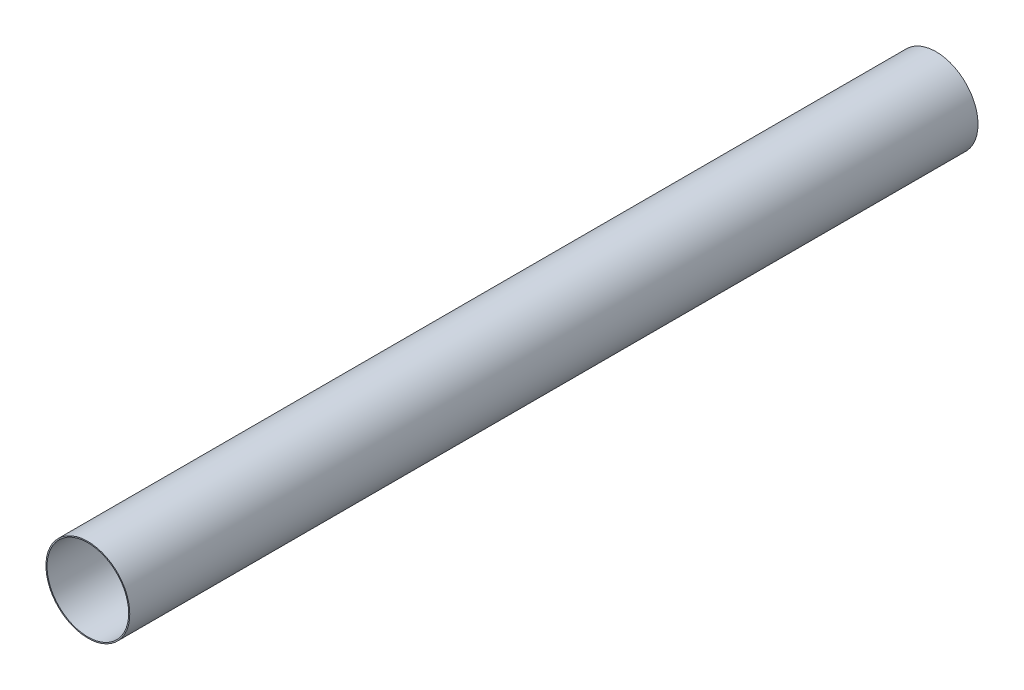
ISO-10303-21;
HEADER;
FILE_DESCRIPTION(('STEP AP214'),'2;1');
FILE_NAME('part.step','',(''),(''),'','','');
FILE_SCHEMA(('AUTOMOTIVE_DESIGN { 1 0 10303 214 1 1 1 1 }'));
ENDSEC;
DATA;
#1=APPLICATION_CONTEXT('core data for automotive mechanical design processes');
#2=APPLICATION_PROTOCOL_DEFINITION('international standard','automotive_design',2000,#1);
#3=PRODUCT_CONTEXT('',#1,'mechanical');
#4=PRODUCT('Part','Part','',(#3));
#5=PRODUCT_RELATED_PRODUCT_CATEGORY('part','',(#4));
#6=PRODUCT_DEFINITION_FORMATION('','',#4);
#7=PRODUCT_DEFINITION_CONTEXT('part definition',#1,'design');
#8=PRODUCT_DEFINITION('design','',#6,#7);
#9=PRODUCT_DEFINITION_SHAPE('','',#8);
#10=(LENGTH_UNIT() NAMED_UNIT(*) SI_UNIT(.MILLI.,.METRE.));
#11=(NAMED_UNIT(*) PLANE_ANGLE_UNIT() SI_UNIT($,.RADIAN.));
#12=(NAMED_UNIT(*) SI_UNIT($,.STERADIAN.) SOLID_ANGLE_UNIT());
#13=UNCERTAINTY_MEASURE_WITH_UNIT(LENGTH_MEASURE(1.E-05),#10,'distance_accuracy_value','');
#14=(GEOMETRIC_REPRESENTATION_CONTEXT(3) GLOBAL_UNCERTAINTY_ASSIGNED_CONTEXT((#13)) GLOBAL_UNIT_ASSIGNED_CONTEXT((#10,
#11,#12)) REPRESENTATION_CONTEXT('',''));
#15=CARTESIAN_POINT('',(0.,0.,0.));
#16=DIRECTION('',(0.,0.,1.));
#17=DIRECTION('',(1.,0.,0.));
#18=AXIS2_PLACEMENT_3D('',#15,#16,#17);
#19=CARTESIAN_POINT('',(0.,0.,1143.));
#20=DIRECTION('',(0.,0.,1.));
#21=DIRECTION('',(1.,0.,0.));
#22=AXIS2_PLACEMENT_3D('',#19,#20,#21);
#23=PLANE('',#22);
#24=CARTESIAN_POINT('',(0.,0.,1143.));
#25=DIRECTION('',(0.,0.,1.));
#26=DIRECTION('',(1.,0.,0.));
#27=AXIS2_PLACEMENT_3D('',#24,#25,#26);
#28=CIRCLE('',#27,56.5);
#29=CARTESIAN_POINT('',(56.5,0.,1143.));
#30=VERTEX_POINT('',#29);
#31=EDGE_CURVE('E10',#30,#30,#28,.T.);
#32=ORIENTED_EDGE('',*,*,#31,.T.);
#33=EDGE_LOOP('',(#32));
#34=FACE_BOUND('',#33,.T.);
#35=CARTESIAN_POINT('',(0.,0.,1143.));
#36=DIRECTION('',(0.,0.,1.));
#37=DIRECTION('',(1.,0.,0.));
#38=AXIS2_PLACEMENT_3D('',#35,#36,#37);
#39=CIRCLE('',#38,55.);
#40=CARTESIAN_POINT('',(55.,0.,1143.));
#41=VERTEX_POINT('',#40);
#42=EDGE_CURVE('E46',#41,#41,#39,.T.);
#43=ORIENTED_EDGE('',*,*,#42,.F.);
#44=EDGE_LOOP('',(#43));
#45=FACE_BOUND('',#44,.T.);
#46=ADVANCED_FACE('F35',(#34,#45),#23,.T.);
#47=CARTESIAN_POINT('',(0.,0.,0.));
#48=DIRECTION('',(0.,0.,1.));
#49=DIRECTION('',(1.,0.,0.));
#50=AXIS2_PLACEMENT_3D('',#47,#48,#49);
#51=PLANE('',#50);
#52=CARTESIAN_POINT('',(0.,0.,0.));
#53=DIRECTION('',(0.,0.,1.));
#54=DIRECTION('',(1.,0.,0.));
#55=AXIS2_PLACEMENT_3D('',#52,#53,#54);
#56=CIRCLE('',#55,56.5);
#57=CARTESIAN_POINT('',(56.5,0.,0.));
#58=VERTEX_POINT('',#57);
#59=EDGE_CURVE('E39',#58,#58,#56,.T.);
#60=ORIENTED_EDGE('',*,*,#59,.F.);
#61=EDGE_LOOP('',(#60));
#62=FACE_BOUND('',#61,.T.);
#63=CARTESIAN_POINT('',(0.,0.,0.));
#64=DIRECTION('',(0.,0.,1.));
#65=DIRECTION('',(1.,0.,0.));
#66=AXIS2_PLACEMENT_3D('',#63,#64,#65);
#67=CIRCLE('',#66,55.);
#68=CARTESIAN_POINT('',(55.,0.,0.));
#69=VERTEX_POINT('',#68);
#70=EDGE_CURVE('E48',#69,#69,#67,.T.);
#71=ORIENTED_EDGE('',*,*,#70,.T.);
#72=EDGE_LOOP('',(#71));
#73=FACE_BOUND('',#72,.T.);
#74=ADVANCED_FACE('F58',(#62,#73),#51,.F.);
#75=CARTESIAN_POINT('',(0.,0.,1143.));
#76=DIRECTION('',(0.,0.,-1.));
#77=DIRECTION('',(-1.,0.,0.));
#78=AXIS2_PLACEMENT_3D('',#75,#76,#77);
#79=CYLINDRICAL_SURFACE('',#78,56.5);
#80=ORIENTED_EDGE('',*,*,#31,.F.);
#81=EDGE_LOOP('',(#80));
#82=FACE_BOUND('',#81,.T.);
#83=ORIENTED_EDGE('',*,*,#59,.T.);
#84=EDGE_LOOP('',(#83));
#85=FACE_BOUND('',#84,.T.);
#86=ADVANCED_FACE('F37',(#82,#85),#79,.T.);
#87=CARTESIAN_POINT('',(0.,0.,1143.));
#88=DIRECTION('',(0.,0.,-1.));
#89=DIRECTION('',(-1.,0.,0.));
#90=AXIS2_PLACEMENT_3D('',#87,#88,#89);
#91=CYLINDRICAL_SURFACE('',#90,55.);
#92=ORIENTED_EDGE('',*,*,#42,.T.);
#93=EDGE_LOOP('',(#92));
#94=FACE_BOUND('',#93,.T.);
#95=ORIENTED_EDGE('',*,*,#70,.F.);
#96=EDGE_LOOP('',(#95));
#97=FACE_BOUND('',#96,.T.);
#98=ADVANCED_FACE('F54',(#94,#97),#91,.F.);
#99=CLOSED_SHELL('',(#46,#74,#86,#98));
#100=MANIFOLD_SOLID_BREP('B2',#99);
#101=ADVANCED_BREP_SHAPE_REPRESENTATION('',(#18,#100),#14);
#102=SHAPE_DEFINITION_REPRESENTATION(#9,#101);
ENDSEC;
END-ISO-10303-21;
